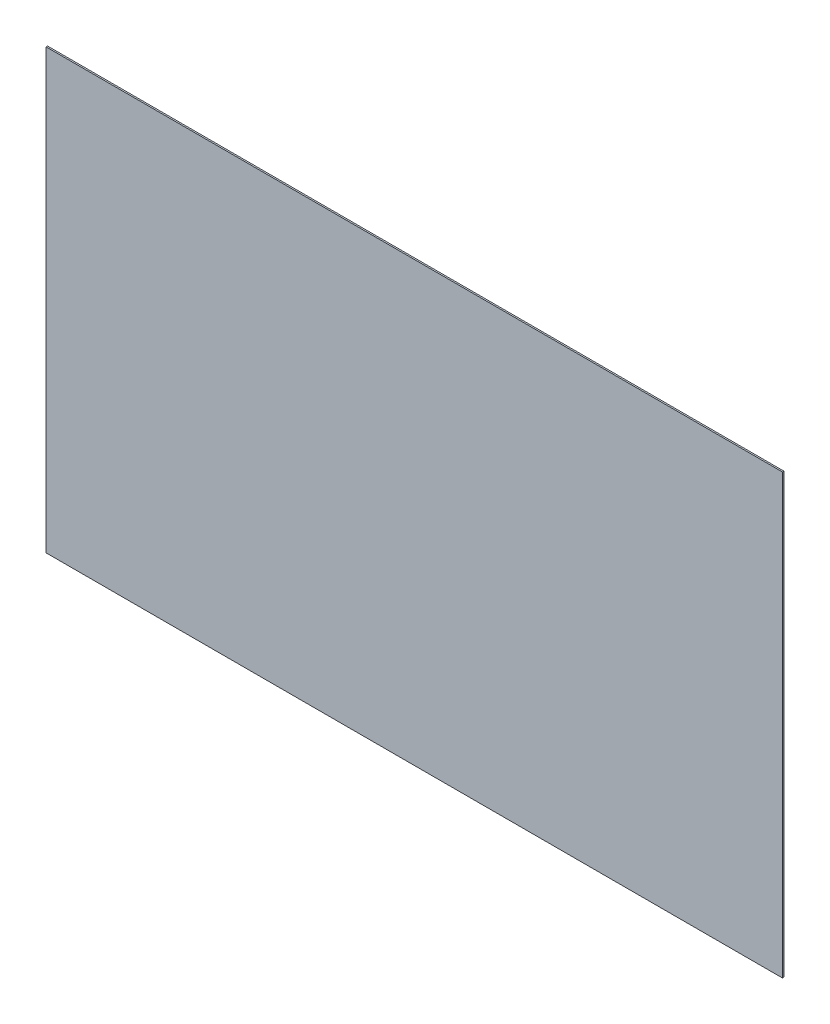
ISO-10303-21;
HEADER;
FILE_DESCRIPTION(('STEP AP214'),'2;1');
FILE_NAME('part.step','',(''),(''),'','','');
FILE_SCHEMA(('AUTOMOTIVE_DESIGN { 1 0 10303 214 1 1 1 1 }'));
ENDSEC;
DATA;
#1=APPLICATION_CONTEXT('core data for automotive mechanical design processes');
#2=APPLICATION_PROTOCOL_DEFINITION('international standard','automotive_design',2000,#1);
#3=PRODUCT_CONTEXT('',#1,'mechanical');
#4=PRODUCT('Part','Part','',(#3));
#5=PRODUCT_RELATED_PRODUCT_CATEGORY('part','',(#4));
#6=PRODUCT_DEFINITION_FORMATION('','',#4);
#7=PRODUCT_DEFINITION_CONTEXT('part definition',#1,'design');
#8=PRODUCT_DEFINITION('design','',#6,#7);
#9=PRODUCT_DEFINITION_SHAPE('','',#8);
#10=(LENGTH_UNIT() NAMED_UNIT(*) SI_UNIT(.MILLI.,.METRE.));
#11=(NAMED_UNIT(*) PLANE_ANGLE_UNIT() SI_UNIT($,.RADIAN.));
#12=(NAMED_UNIT(*) SI_UNIT($,.STERADIAN.) SOLID_ANGLE_UNIT());
#13=UNCERTAINTY_MEASURE_WITH_UNIT(LENGTH_MEASURE(1.E-05),#10,'distance_accuracy_value','');
#14=(GEOMETRIC_REPRESENTATION_CONTEXT(3) GLOBAL_UNCERTAINTY_ASSIGNED_CONTEXT((#13)) GLOBAL_UNIT_ASSIGNED_CONTEXT((#10,
#11,#12)) REPRESENTATION_CONTEXT('',''));
#15=CARTESIAN_POINT('',(0.,0.,0.));
#16=DIRECTION('',(0.,0.,1.));
#17=DIRECTION('',(1.,0.,0.));
#18=AXIS2_PLACEMENT_3D('',#15,#16,#17);
#19=CARTESIAN_POINT('',(0.,0.95,0.05));
#20=DIRECTION('',(0.,0.,1.));
#21=DIRECTION('',(1.,0.,0.));
#22=AXIS2_PLACEMENT_3D('',#19,#20,#21);
#23=PLANE('',#22);
#24=DIRECTION('',(0.,1.,0.));
#25=VECTOR('',#24,1.);
#26=CARTESIAN_POINT('',(-12.35,-6.4,0.05));
#27=LINE('',#26,#25);
#28=CARTESIAN_POINT('',(-12.35,-6.4,0.05));
#29=VERTEX_POINT('',#28);
#30=CARTESIAN_POINT('',(-12.35,8.3,0.05));
#31=VERTEX_POINT('',#30);
#32=EDGE_CURVE('E24',#29,#31,#27,.T.);
#33=ORIENTED_EDGE('',*,*,#32,.F.);
#34=DIRECTION('',(-1.,0.,0.));
#35=VECTOR('',#34,1.);
#36=CARTESIAN_POINT('',(12.35,-6.4,0.05));
#37=LINE('',#36,#35);
#38=CARTESIAN_POINT('',(12.35,-6.4,0.05));
#39=VERTEX_POINT('',#38);
#40=EDGE_CURVE('E93',#39,#29,#37,.T.);
#41=ORIENTED_EDGE('',*,*,#40,.F.);
#42=DIRECTION('',(0.,-1.,0.));
#43=VECTOR('',#42,1.);
#44=CARTESIAN_POINT('',(12.35,8.3,0.05));
#45=LINE('',#44,#43);
#46=CARTESIAN_POINT('',(12.35,8.3,0.05));
#47=VERTEX_POINT('',#46);
#48=EDGE_CURVE('E81',#47,#39,#45,.T.);
#49=ORIENTED_EDGE('',*,*,#48,.F.);
#50=DIRECTION('',(1.,0.,0.));
#51=VECTOR('',#50,1.);
#52=CARTESIAN_POINT('',(-12.35,8.3,0.05));
#53=LINE('',#52,#51);
#54=EDGE_CURVE('E85',#31,#47,#53,.T.);
#55=ORIENTED_EDGE('',*,*,#54,.F.);
#56=EDGE_LOOP('',(#33,#41,#49,#55));
#57=FACE_BOUND('',#56,.T.);
#58=ADVANCED_FACE('F16',(#57),#23,.T.);
#59=CARTESIAN_POINT('',(0.,0.95,0.));
#60=DIRECTION('',(0.,0.,1.));
#61=DIRECTION('',(1.,0.,0.));
#62=AXIS2_PLACEMENT_3D('',#59,#60,#61);
#63=PLANE('',#62);
#64=DIRECTION('',(1.,0.,0.));
#65=VECTOR('',#64,1.);
#66=CARTESIAN_POINT('',(-12.35,8.3,0.));
#67=LINE('',#66,#65);
#68=CARTESIAN_POINT('',(-12.35,8.3,0.));
#69=VERTEX_POINT('',#68);
#70=CARTESIAN_POINT('',(12.35,8.3,0.));
#71=VERTEX_POINT('',#70);
#72=EDGE_CURVE('E69',#69,#71,#67,.T.);
#73=ORIENTED_EDGE('',*,*,#72,.T.);
#74=DIRECTION('',(0.,-1.,0.));
#75=VECTOR('',#74,1.);
#76=CARTESIAN_POINT('',(12.35,8.3,0.));
#77=LINE('',#76,#75);
#78=CARTESIAN_POINT('',(12.35,-6.4,0.));
#79=VERTEX_POINT('',#78);
#80=EDGE_CURVE('E104',#71,#79,#77,.T.);
#81=ORIENTED_EDGE('',*,*,#80,.T.);
#82=DIRECTION('',(-1.,0.,0.));
#83=VECTOR('',#82,1.);
#84=CARTESIAN_POINT('',(12.35,-6.4,0.));
#85=LINE('',#84,#83);
#86=CARTESIAN_POINT('',(-12.35,-6.4,0.));
#87=VERTEX_POINT('',#86);
#88=EDGE_CURVE('E71',#79,#87,#85,.T.);
#89=ORIENTED_EDGE('',*,*,#88,.T.);
#90=DIRECTION('',(0.,1.,0.));
#91=VECTOR('',#90,1.);
#92=CARTESIAN_POINT('',(-12.35,-6.4,0.));
#93=LINE('',#92,#91);
#94=EDGE_CURVE('E10',#87,#69,#93,.T.);
#95=ORIENTED_EDGE('',*,*,#94,.T.);
#96=EDGE_LOOP('',(#73,#81,#89,#95));
#97=FACE_BOUND('',#96,.T.);
#98=ADVANCED_FACE('F67',(#97),#63,.F.);
#99=CARTESIAN_POINT('',(-12.35,-6.4,0.));
#100=DIRECTION('',(-1.,0.,0.));
#101=DIRECTION('',(0.,0.,1.));
#102=AXIS2_PLACEMENT_3D('',#99,#100,#101);
#103=PLANE('',#102);
#104=DIRECTION('',(0.,0.,1.));
#105=VECTOR('',#104,1.);
#106=CARTESIAN_POINT('',(-12.35,-6.4,0.));
#107=LINE('',#106,#105);
#108=EDGE_CURVE('E107',#87,#29,#107,.T.);
#109=ORIENTED_EDGE('',*,*,#108,.T.);
#110=ORIENTED_EDGE('',*,*,#32,.T.);
#111=DIRECTION('',(0.,0.,1.));
#112=VECTOR('',#111,1.);
#113=CARTESIAN_POINT('',(-12.35,8.3,0.));
#114=LINE('',#113,#112);
#115=EDGE_CURVE('E77',#69,#31,#114,.T.);
#116=ORIENTED_EDGE('',*,*,#115,.F.);
#117=ORIENTED_EDGE('',*,*,#94,.F.);
#118=EDGE_LOOP('',(#109,#110,#116,#117));
#119=FACE_BOUND('',#118,.T.);
#120=ADVANCED_FACE('F83',(#119),#103,.T.);
#121=CARTESIAN_POINT('',(12.35,-6.4,0.));
#122=DIRECTION('',(0.,-1.,0.));
#123=DIRECTION('',(0.,0.,-1.));
#124=AXIS2_PLACEMENT_3D('',#121,#122,#123);
#125=PLANE('',#124);
#126=DIRECTION('',(0.,0.,1.));
#127=VECTOR('',#126,1.);
#128=CARTESIAN_POINT('',(12.35,-6.4,0.));
#129=LINE('',#128,#127);
#130=EDGE_CURVE('E97',#79,#39,#129,.T.);
#131=ORIENTED_EDGE('',*,*,#130,.T.);
#132=ORIENTED_EDGE('',*,*,#40,.T.);
#133=ORIENTED_EDGE('',*,*,#108,.F.);
#134=ORIENTED_EDGE('',*,*,#88,.F.);
#135=EDGE_LOOP('',(#131,#132,#133,#134));
#136=FACE_BOUND('',#135,.T.);
#137=ADVANCED_FACE('F149',(#136),#125,.T.);
#138=CARTESIAN_POINT('',(12.35,8.3,0.));
#139=DIRECTION('',(1.,0.,0.));
#140=DIRECTION('',(0.,1.,0.));
#141=AXIS2_PLACEMENT_3D('',#138,#139,#140);
#142=PLANE('',#141);
#143=DIRECTION('',(0.,0.,1.));
#144=VECTOR('',#143,1.);
#145=CARTESIAN_POINT('',(12.35,8.3,0.));
#146=LINE('',#145,#144);
#147=EDGE_CURVE('E79',#71,#47,#146,.T.);
#148=ORIENTED_EDGE('',*,*,#147,.T.);
#149=ORIENTED_EDGE('',*,*,#48,.T.);
#150=ORIENTED_EDGE('',*,*,#130,.F.);
#151=ORIENTED_EDGE('',*,*,#80,.F.);
#152=EDGE_LOOP('',(#148,#149,#150,#151));
#153=FACE_BOUND('',#152,.T.);
#154=ADVANCED_FACE('F152',(#153),#142,.T.);
#155=CARTESIAN_POINT('',(-12.35,8.3,0.));
#156=DIRECTION('',(0.,1.,0.));
#157=DIRECTION('',(1.,0.,0.));
#158=AXIS2_PLACEMENT_3D('',#155,#156,#157);
#159=PLANE('',#158);
#160=ORIENTED_EDGE('',*,*,#115,.T.);
#161=ORIENTED_EDGE('',*,*,#54,.T.);
#162=ORIENTED_EDGE('',*,*,#147,.F.);
#163=ORIENTED_EDGE('',*,*,#72,.F.);
#164=EDGE_LOOP('',(#160,#161,#162,#163));
#165=FACE_BOUND('',#164,.T.);
#166=ADVANCED_FACE('F75',(#165),#159,.T.);
#167=CLOSED_SHELL('',(#58,#98,#120,#137,#154,#166));
#168=MANIFOLD_SOLID_BREP('B1',#167);
#169=ADVANCED_BREP_SHAPE_REPRESENTATION('',(#18,#168),#14);
#170=SHAPE_DEFINITION_REPRESENTATION(#9,#169);
ENDSEC;
END-ISO-10303-21;
